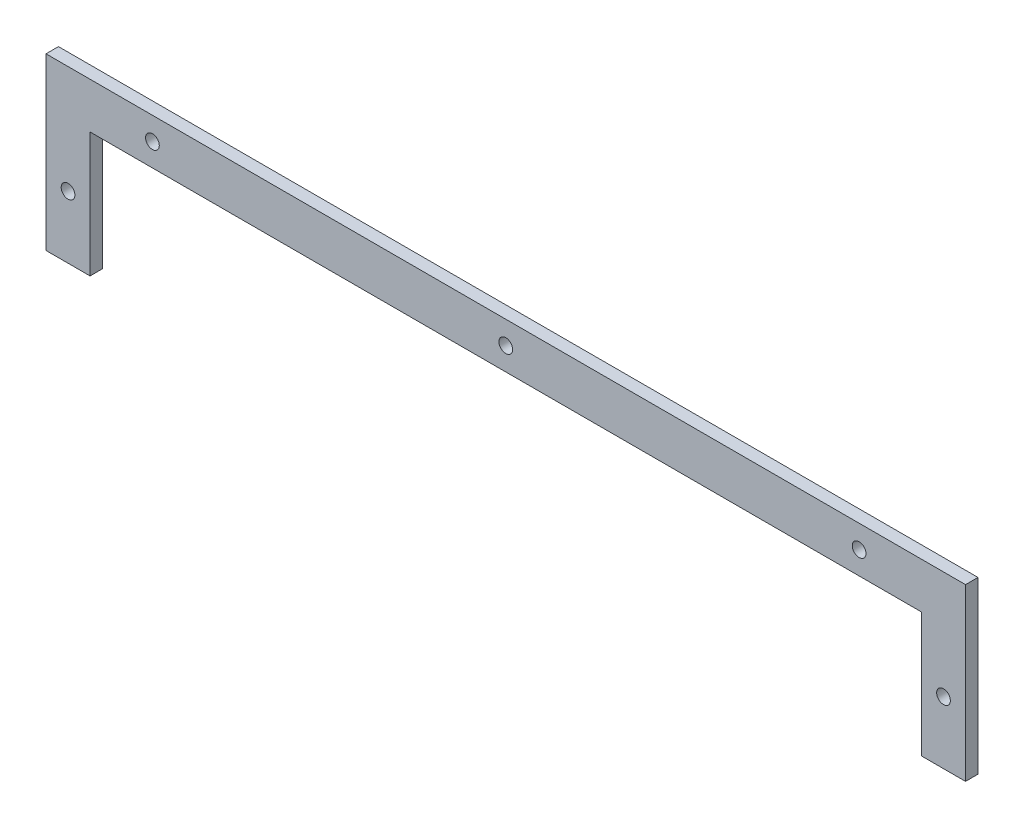
ISO-10303-21;
HEADER;
FILE_DESCRIPTION(('STEP AP214'),'2;1');
FILE_NAME('part.step','',(''),(''),'','','');
FILE_SCHEMA(('AUTOMOTIVE_DESIGN { 1 0 10303 214 1 1 1 1 }'));
ENDSEC;
DATA;
#1=APPLICATION_CONTEXT('core data for automotive mechanical design processes');
#2=APPLICATION_PROTOCOL_DEFINITION('international standard','automotive_design',2000,#1);
#3=PRODUCT_CONTEXT('',#1,'mechanical');
#4=PRODUCT('Part','Part','',(#3));
#5=PRODUCT_RELATED_PRODUCT_CATEGORY('part','',(#4));
#6=PRODUCT_DEFINITION_FORMATION('','',#4);
#7=PRODUCT_DEFINITION_CONTEXT('part definition',#1,'design');
#8=PRODUCT_DEFINITION('design','',#6,#7);
#9=PRODUCT_DEFINITION_SHAPE('','',#8);
#10=(LENGTH_UNIT() NAMED_UNIT(*) SI_UNIT(.MILLI.,.METRE.));
#11=(NAMED_UNIT(*) PLANE_ANGLE_UNIT() SI_UNIT($,.RADIAN.));
#12=(NAMED_UNIT(*) SI_UNIT($,.STERADIAN.) SOLID_ANGLE_UNIT());
#13=UNCERTAINTY_MEASURE_WITH_UNIT(LENGTH_MEASURE(1.E-05),#10,'distance_accuracy_value','');
#14=(GEOMETRIC_REPRESENTATION_CONTEXT(3) GLOBAL_UNCERTAINTY_ASSIGNED_CONTEXT((#13)) GLOBAL_UNIT_ASSIGNED_CONTEXT((#10,
#11,#12)) REPRESENTATION_CONTEXT('',''));
#15=CARTESIAN_POINT('',(0.,0.,0.));
#16=DIRECTION('',(0.,0.,1.));
#17=DIRECTION('',(1.,0.,0.));
#18=AXIS2_PLACEMENT_3D('',#15,#16,#17);
#19=CARTESIAN_POINT('',(0.,0.,3.));
#20=DIRECTION('',(0.,0.,-1.));
#21=DIRECTION('',(-1.,0.,0.));
#22=AXIS2_PLACEMENT_3D('',#19,#20,#21);
#23=PLANE('',#22);
#24=DIRECTION('',(0.,1.,0.));
#25=VECTOR('',#24,1.);
#26=CARTESIAN_POINT('',(76.1518031358719,236.850888729095,3.));
#27=LINE('',#26,#25);
#28=CARTESIAN_POINT('',(76.1518031358719,236.850888729095,3.));
#29=VERTEX_POINT('',#28);
#30=CARTESIAN_POINT('',(76.1518031358719,266.850888729095,3.));
#31=VERTEX_POINT('',#30);
#32=EDGE_CURVE('E151',#29,#31,#27,.T.);
#33=ORIENTED_EDGE('',*,*,#32,.T.);
#34=DIRECTION('',(1.,0.,0.));
#35=VECTOR('',#34,1.);
#36=CARTESIAN_POINT('',(76.1518031358719,266.850888729095,3.));
#37=LINE('',#36,#35);
#38=CARTESIAN_POINT('',(276.149988174438,266.850888729095,3.));
#39=VERTEX_POINT('',#38);
#40=EDGE_CURVE('E99',#31,#39,#37,.T.);
#41=ORIENTED_EDGE('',*,*,#40,.T.);
#42=DIRECTION('',(0.,-1.,0.));
#43=VECTOR('',#42,1.);
#44=CARTESIAN_POINT('',(276.149988174438,266.850888729095,3.));
#45=LINE('',#44,#43);
#46=CARTESIAN_POINT('',(276.149988174438,236.850888729095,3.));
#47=VERTEX_POINT('',#46);
#48=EDGE_CURVE('E166',#39,#47,#45,.T.);
#49=ORIENTED_EDGE('',*,*,#48,.T.);
#50=DIRECTION('',(1.,0.,0.));
#51=VECTOR('',#50,1.);
#52=CARTESIAN_POINT('',(276.149988174438,236.850888729095,3.));
#53=LINE('',#52,#51);
#54=CARTESIAN_POINT('',(286.750207375986,236.850888729095,3.));
#55=VERTEX_POINT('',#54);
#56=EDGE_CURVE('E179',#47,#55,#53,.T.);
#57=ORIENTED_EDGE('',*,*,#56,.T.);
#58=DIRECTION('',(-5.33201121228377E-06,0.999999999985785,0.));
#59=VECTOR('',#58,1.);
#60=CARTESIAN_POINT('',(286.750207375986,236.850888729095,3.));
#61=LINE('',#60,#59);
#62=CARTESIAN_POINT('',(286.749988794327,277.845112205294,3.));
#63=VERTEX_POINT('',#62);
#64=EDGE_CURVE('E118',#55,#63,#61,.T.);
#65=ORIENTED_EDGE('',*,*,#64,.T.);
#66=DIRECTION('',(-0.999999998598843,-5.29368899106635E-05,0.));
#67=VECTOR('',#66,1.);
#68=CARTESIAN_POINT('',(65.5498809996054,277.833402559523,3.));
#69=LINE('',#68,#67);
#70=CARTESIAN_POINT('',(65.5498809996054,277.833402559523,3.));
#71=VERTEX_POINT('',#70);
#72=EDGE_CURVE('E112',#63,#71,#69,.T.);
#73=ORIENTED_EDGE('',*,*,#72,.T.);
#74=DIRECTION('',(0.,-1.,0.));
#75=VECTOR('',#74,1.);
#76=CARTESIAN_POINT('',(65.5498809996054,277.833402559523,3.));
#77=LINE('',#76,#75);
#78=CARTESIAN_POINT('',(65.5498809996054,236.850888729095,3.));
#79=VERTEX_POINT('',#78);
#80=EDGE_CURVE('E116',#71,#79,#77,.T.);
#81=ORIENTED_EDGE('',*,*,#80,.T.);
#82=DIRECTION('',(1.,0.,0.));
#83=VECTOR('',#82,1.);
#84=CARTESIAN_POINT('',(76.1518031358719,236.850888729095,3.));
#85=LINE('',#84,#83);
#86=EDGE_CURVE('E56',#79,#29,#85,.T.);
#87=ORIENTED_EDGE('',*,*,#86,.T.);
#88=EDGE_LOOP('',(#33,#41,#49,#57,#65,#73,#81,#87));
#89=FACE_BOUND('',#88,.T.);
#90=CARTESIAN_POINT('',(70.8508420677386,251.850888729095,3.));
#91=DIRECTION('',(0.,0.,1.));
#92=DIRECTION('',(1.,0.,0.));
#93=AXIS2_PLACEMENT_3D('',#90,#91,#92);
#94=CIRCLE('',#93,1.65000000000003);
#95=CARTESIAN_POINT('',(72.5008420677387,251.850888729095,3.));
#96=VERTEX_POINT('',#95);
#97=EDGE_CURVE('E140',#96,#96,#94,.T.);
#98=ORIENTED_EDGE('',*,*,#97,.F.);
#99=EDGE_LOOP('',(#98));
#100=FACE_BOUND('',#99,.T.);
#101=CARTESIAN_POINT('',(91.1518031358719,272.342426260702,3.));
#102=DIRECTION('',(0.,0.,1.));
#103=DIRECTION('',(1.,0.,0.));
#104=AXIS2_PLACEMENT_3D('',#101,#102,#103);
#105=CIRCLE('',#104,1.65000000000003);
#106=CARTESIAN_POINT('',(92.8018031358719,272.342426260702,3.));
#107=VERTEX_POINT('',#106);
#108=EDGE_CURVE('E188',#107,#107,#105,.T.);
#109=ORIENTED_EDGE('',*,*,#108,.F.);
#110=EDGE_LOOP('',(#109));
#111=FACE_BOUND('',#110,.T.);
#112=CARTESIAN_POINT('',(176.149949567158,272.342426260702,3.));
#113=DIRECTION('',(0.,0.,1.));
#114=DIRECTION('',(1.,0.,0.));
#115=AXIS2_PLACEMENT_3D('',#112,#113,#114);
#116=CIRCLE('',#115,1.64999999999999);
#117=CARTESIAN_POINT('',(177.799949567158,272.342426260702,3.));
#118=VERTEX_POINT('',#117);
#119=EDGE_CURVE('E194',#118,#118,#116,.T.);
#120=ORIENTED_EDGE('',*,*,#119,.F.);
#121=EDGE_LOOP('',(#120));
#122=FACE_BOUND('',#121,.T.);
#123=CARTESIAN_POINT('',(261.148095998443,272.342426260702,3.));
#124=DIRECTION('',(0.,0.,1.));
#125=DIRECTION('',(1.,0.,0.));
#126=AXIS2_PLACEMENT_3D('',#123,#124,#125);
#127=CIRCLE('',#126,1.64999999999994);
#128=CARTESIAN_POINT('',(262.798095998443,272.342426260702,3.));
#129=VERTEX_POINT('',#128);
#130=EDGE_CURVE('E200',#129,#129,#127,.T.);
#131=ORIENTED_EDGE('',*,*,#130,.F.);
#132=EDGE_LOOP('',(#131));
#133=FACE_BOUND('',#132,.T.);
#134=CARTESIAN_POINT('',(281.449057066577,251.850888729095,3.));
#135=DIRECTION('',(0.,0.,1.));
#136=DIRECTION('',(1.,0.,0.));
#137=AXIS2_PLACEMENT_3D('',#134,#135,#136);
#138=CIRCLE('',#137,1.64999999999999);
#139=CARTESIAN_POINT('',(283.099057066577,251.850888729095,3.));
#140=VERTEX_POINT('',#139);
#141=EDGE_CURVE('E206',#140,#140,#138,.T.);
#142=ORIENTED_EDGE('',*,*,#141,.F.);
#143=EDGE_LOOP('',(#142));
#144=FACE_BOUND('',#143,.T.);
#145=ADVANCED_FACE('F39',(#89,#100,#111,#122,#133,#144),#23,.F.);
#146=CARTESIAN_POINT('',(0.,0.,0.));
#147=DIRECTION('',(0.,0.,-1.));
#148=DIRECTION('',(-1.,0.,0.));
#149=AXIS2_PLACEMENT_3D('',#146,#147,#148);
#150=PLANE('',#149);
#151=CARTESIAN_POINT('',(261.148095998443,272.342426260702,0.));
#152=DIRECTION('',(0.,0.,1.));
#153=DIRECTION('',(1.,0.,0.));
#154=AXIS2_PLACEMENT_3D('',#151,#152,#153);
#155=CIRCLE('',#154,1.64999999999994);
#156=CARTESIAN_POINT('',(262.798095998443,272.342426260702,0.));
#157=VERTEX_POINT('',#156);
#158=EDGE_CURVE('E203',#157,#157,#155,.T.);
#159=ORIENTED_EDGE('',*,*,#158,.T.);
#160=EDGE_LOOP('',(#159));
#161=FACE_BOUND('',#160,.T.);
#162=CARTESIAN_POINT('',(91.1518031358719,272.342426260702,0.));
#163=DIRECTION('',(0.,0.,1.));
#164=DIRECTION('',(1.,0.,0.));
#165=AXIS2_PLACEMENT_3D('',#162,#163,#164);
#166=CIRCLE('',#165,1.65000000000003);
#167=CARTESIAN_POINT('',(92.8018031358719,272.342426260702,0.));
#168=VERTEX_POINT('',#167);
#169=EDGE_CURVE('E191',#168,#168,#166,.T.);
#170=ORIENTED_EDGE('',*,*,#169,.T.);
#171=EDGE_LOOP('',(#170));
#172=FACE_BOUND('',#171,.T.);
#173=DIRECTION('',(0.,1.,0.));
#174=VECTOR('',#173,1.);
#175=CARTESIAN_POINT('',(76.1518031358719,236.850888729095,0.));
#176=LINE('',#175,#174);
#177=CARTESIAN_POINT('',(76.1518031358719,236.850888729095,0.));
#178=VERTEX_POINT('',#177);
#179=CARTESIAN_POINT('',(76.1518031358719,266.850888729095,0.));
#180=VERTEX_POINT('',#179);
#181=EDGE_CURVE('E136',#178,#180,#176,.T.);
#182=ORIENTED_EDGE('',*,*,#181,.F.);
#183=DIRECTION('',(1.,0.,0.));
#184=VECTOR('',#183,1.);
#185=CARTESIAN_POINT('',(76.1518031358719,236.850888729095,0.));
#186=LINE('',#185,#184);
#187=CARTESIAN_POINT('',(65.5498809996054,236.850888729095,0.));
#188=VERTEX_POINT('',#187);
#189=EDGE_CURVE('E91',#188,#178,#186,.T.);
#190=ORIENTED_EDGE('',*,*,#189,.F.);
#191=DIRECTION('',(0.,-1.,0.));
#192=VECTOR('',#191,1.);
#193=CARTESIAN_POINT('',(65.5498809996054,277.833402559523,0.));
#194=LINE('',#193,#192);
#195=CARTESIAN_POINT('',(65.5498809996054,277.833402559523,0.));
#196=VERTEX_POINT('',#195);
#197=EDGE_CURVE('E85',#196,#188,#194,.T.);
#198=ORIENTED_EDGE('',*,*,#197,.F.);
#199=DIRECTION('',(-0.999999998598843,-5.29368899106635E-05,0.));
#200=VECTOR('',#199,1.);
#201=CARTESIAN_POINT('',(65.5498809996054,277.833402559523,0.));
#202=LINE('',#201,#200);
#203=CARTESIAN_POINT('',(286.749988794327,277.845112205294,0.));
#204=VERTEX_POINT('',#203);
#205=EDGE_CURVE('E126',#204,#196,#202,.T.);
#206=ORIENTED_EDGE('',*,*,#205,.F.);
#207=DIRECTION('',(-5.33201121228377E-06,0.999999999985785,0.));
#208=VECTOR('',#207,1.);
#209=CARTESIAN_POINT('',(286.750207375986,236.850888729095,0.));
#210=LINE('',#209,#208);
#211=CARTESIAN_POINT('',(286.750207375986,236.850888729095,0.));
#212=VERTEX_POINT('',#211);
#213=EDGE_CURVE('E146',#212,#204,#210,.T.);
#214=ORIENTED_EDGE('',*,*,#213,.F.);
#215=DIRECTION('',(1.,0.,0.));
#216=VECTOR('',#215,1.);
#217=CARTESIAN_POINT('',(276.149988174438,236.850888729095,0.));
#218=LINE('',#217,#216);
#219=CARTESIAN_POINT('',(276.149988174438,236.850888729095,0.));
#220=VERTEX_POINT('',#219);
#221=EDGE_CURVE('E144',#220,#212,#218,.T.);
#222=ORIENTED_EDGE('',*,*,#221,.F.);
#223=DIRECTION('',(0.,-1.,0.));
#224=VECTOR('',#223,1.);
#225=CARTESIAN_POINT('',(276.149988174438,266.850888729095,0.));
#226=LINE('',#225,#224);
#227=CARTESIAN_POINT('',(276.149988174438,266.850888729095,0.));
#228=VERTEX_POINT('',#227);
#229=EDGE_CURVE('E142',#228,#220,#226,.T.);
#230=ORIENTED_EDGE('',*,*,#229,.F.);
#231=DIRECTION('',(1.,0.,0.));
#232=VECTOR('',#231,1.);
#233=CARTESIAN_POINT('',(76.1518031358719,266.850888729095,0.));
#234=LINE('',#233,#232);
#235=EDGE_CURVE('E139',#180,#228,#234,.T.);
#236=ORIENTED_EDGE('',*,*,#235,.F.);
#237=EDGE_LOOP('',(#182,#190,#198,#206,#214,#222,#230,#236));
#238=FACE_BOUND('',#237,.T.);
#239=CARTESIAN_POINT('',(70.8508420677386,251.850888729095,0.));
#240=DIRECTION('',(0.,0.,1.));
#241=DIRECTION('',(1.,0.,0.));
#242=AXIS2_PLACEMENT_3D('',#239,#240,#241);
#243=CIRCLE('',#242,1.65000000000003);
#244=CARTESIAN_POINT('',(72.5008420677387,251.850888729095,0.));
#245=VERTEX_POINT('',#244);
#246=EDGE_CURVE('E185',#245,#245,#243,.T.);
#247=ORIENTED_EDGE('',*,*,#246,.T.);
#248=EDGE_LOOP('',(#247));
#249=FACE_BOUND('',#248,.T.);
#250=CARTESIAN_POINT('',(176.149949567158,272.342426260702,0.));
#251=DIRECTION('',(0.,0.,1.));
#252=DIRECTION('',(1.,0.,0.));
#253=AXIS2_PLACEMENT_3D('',#250,#251,#252);
#254=CIRCLE('',#253,1.64999999999999);
#255=CARTESIAN_POINT('',(177.799949567158,272.342426260702,0.));
#256=VERTEX_POINT('',#255);
#257=EDGE_CURVE('E197',#256,#256,#254,.T.);
#258=ORIENTED_EDGE('',*,*,#257,.T.);
#259=EDGE_LOOP('',(#258));
#260=FACE_BOUND('',#259,.T.);
#261=CARTESIAN_POINT('',(281.449057066577,251.850888729095,0.));
#262=DIRECTION('',(0.,0.,1.));
#263=DIRECTION('',(1.,0.,0.));
#264=AXIS2_PLACEMENT_3D('',#261,#262,#263);
#265=CIRCLE('',#264,1.64999999999999);
#266=CARTESIAN_POINT('',(283.099057066577,251.850888729095,0.));
#267=VERTEX_POINT('',#266);
#268=EDGE_CURVE('E209',#267,#267,#265,.T.);
#269=ORIENTED_EDGE('',*,*,#268,.T.);
#270=EDGE_LOOP('',(#269));
#271=FACE_BOUND('',#270,.T.);
#272=ADVANCED_FACE('F170',(#161,#172,#238,#249,#260,#271),#150,.T.);
#273=CARTESIAN_POINT('',(76.1518031358719,236.850888729095,3.));
#274=DIRECTION('',(-1.,0.,0.));
#275=DIRECTION('',(0.,0.,1.));
#276=AXIS2_PLACEMENT_3D('',#273,#274,#275);
#277=PLANE('',#276);
#278=ORIENTED_EDGE('',*,*,#181,.T.);
#279=DIRECTION('',(0.,0.,-1.));
#280=VECTOR('',#279,1.);
#281=CARTESIAN_POINT('',(76.1518031358719,266.850888729095,3.));
#282=LINE('',#281,#280);
#283=EDGE_CURVE('E11',#31,#180,#282,.T.);
#284=ORIENTED_EDGE('',*,*,#283,.F.);
#285=ORIENTED_EDGE('',*,*,#32,.F.);
#286=DIRECTION('',(0.,0.,-1.));
#287=VECTOR('',#286,1.);
#288=CARTESIAN_POINT('',(76.1518031358719,236.850888729095,3.));
#289=LINE('',#288,#287);
#290=EDGE_CURVE('E132',#29,#178,#289,.T.);
#291=ORIENTED_EDGE('',*,*,#290,.T.);
#292=EDGE_LOOP('',(#278,#284,#285,#291));
#293=FACE_BOUND('',#292,.T.);
#294=ADVANCED_FACE('F41',(#293),#277,.F.);
#295=CARTESIAN_POINT('',(76.1518031358719,266.850888729095,3.));
#296=DIRECTION('',(0.,1.,0.));
#297=DIRECTION('',(0.,0.,1.));
#298=AXIS2_PLACEMENT_3D('',#295,#296,#297);
#299=PLANE('',#298);
#300=ORIENTED_EDGE('',*,*,#235,.T.);
#301=DIRECTION('',(0.,0.,-1.));
#302=VECTOR('',#301,1.);
#303=CARTESIAN_POINT('',(276.149988174438,266.850888729095,3.));
#304=LINE('',#303,#302);
#305=EDGE_CURVE('E48',#39,#228,#304,.T.);
#306=ORIENTED_EDGE('',*,*,#305,.F.);
#307=ORIENTED_EDGE('',*,*,#40,.F.);
#308=ORIENTED_EDGE('',*,*,#283,.T.);
#309=EDGE_LOOP('',(#300,#306,#307,#308));
#310=FACE_BOUND('',#309,.T.);
#311=ADVANCED_FACE('F241',(#310),#299,.F.);
#312=CARTESIAN_POINT('',(276.149988174438,266.850888729095,3.));
#313=DIRECTION('',(1.,0.,0.));
#314=DIRECTION('',(0.,0.,-1.));
#315=AXIS2_PLACEMENT_3D('',#312,#313,#314);
#316=PLANE('',#315);
#317=ORIENTED_EDGE('',*,*,#229,.T.);
#318=DIRECTION('',(0.,0.,-1.));
#319=VECTOR('',#318,1.);
#320=CARTESIAN_POINT('',(276.149988174438,236.850888729095,3.));
#321=LINE('',#320,#319);
#322=EDGE_CURVE('E158',#47,#220,#321,.T.);
#323=ORIENTED_EDGE('',*,*,#322,.F.);
#324=ORIENTED_EDGE('',*,*,#48,.F.);
#325=ORIENTED_EDGE('',*,*,#305,.T.);
#326=EDGE_LOOP('',(#317,#323,#324,#325));
#327=FACE_BOUND('',#326,.T.);
#328=ADVANCED_FACE('F164',(#327),#316,.F.);
#329=CARTESIAN_POINT('',(276.149988174438,236.850888729095,3.));
#330=DIRECTION('',(0.,1.,0.));
#331=DIRECTION('',(0.,0.,1.));
#332=AXIS2_PLACEMENT_3D('',#329,#330,#331);
#333=PLANE('',#332);
#334=ORIENTED_EDGE('',*,*,#221,.T.);
#335=DIRECTION('',(0.,0.,-1.));
#336=VECTOR('',#335,1.);
#337=CARTESIAN_POINT('',(286.750207375986,236.850888729095,3.));
#338=LINE('',#337,#336);
#339=EDGE_CURVE('E155',#55,#212,#338,.T.);
#340=ORIENTED_EDGE('',*,*,#339,.F.);
#341=ORIENTED_EDGE('',*,*,#56,.F.);
#342=ORIENTED_EDGE('',*,*,#322,.T.);
#343=EDGE_LOOP('',(#334,#340,#341,#342));
#344=FACE_BOUND('',#343,.T.);
#345=ADVANCED_FACE('F175',(#344),#333,.F.);
#346=CARTESIAN_POINT('',(286.750207375986,236.850888729095,3.));
#347=DIRECTION('',(-0.999999999985785,-5.33201121228377E-06,0.));
#348=DIRECTION('',(5.33201121228377E-06,-0.999999999985785,0.));
#349=AXIS2_PLACEMENT_3D('',#346,#347,#348);
#350=PLANE('',#349);
#351=ORIENTED_EDGE('',*,*,#213,.T.);
#352=DIRECTION('',(0.,0.,-1.));
#353=VECTOR('',#352,1.);
#354=CARTESIAN_POINT('',(286.749988794327,277.845112205294,3.));
#355=LINE('',#354,#353);
#356=EDGE_CURVE('E127',#63,#204,#355,.T.);
#357=ORIENTED_EDGE('',*,*,#356,.F.);
#358=ORIENTED_EDGE('',*,*,#64,.F.);
#359=ORIENTED_EDGE('',*,*,#339,.T.);
#360=EDGE_LOOP('',(#351,#357,#358,#359));
#361=FACE_BOUND('',#360,.T.);
#362=ADVANCED_FACE('F178',(#361),#350,.F.);
#363=CARTESIAN_POINT('',(65.5498809996054,277.833402559523,3.));
#364=DIRECTION('',(5.29368899106635E-05,-0.999999998598843,0.));
#365=DIRECTION('',(0.999999998598843,5.29368899106635E-05,0.));
#366=AXIS2_PLACEMENT_3D('',#363,#364,#365);
#367=PLANE('',#366);
#368=ORIENTED_EDGE('',*,*,#205,.T.);
#369=DIRECTION('',(0.,0.,-1.));
#370=VECTOR('',#369,1.);
#371=CARTESIAN_POINT('',(65.5498809996054,277.833402559523,3.));
#372=LINE('',#371,#370);
#373=EDGE_CURVE('E123',#71,#196,#372,.T.);
#374=ORIENTED_EDGE('',*,*,#373,.F.);
#375=ORIENTED_EDGE('',*,*,#72,.F.);
#376=ORIENTED_EDGE('',*,*,#356,.T.);
#377=EDGE_LOOP('',(#368,#374,#375,#376));
#378=FACE_BOUND('',#377,.T.);
#379=ADVANCED_FACE('F124',(#378),#367,.F.);
#380=CARTESIAN_POINT('',(65.5498809996054,277.833402559523,3.));
#381=DIRECTION('',(1.,0.,0.));
#382=DIRECTION('',(0.,1.,0.));
#383=AXIS2_PLACEMENT_3D('',#380,#381,#382);
#384=PLANE('',#383);
#385=ORIENTED_EDGE('',*,*,#197,.T.);
#386=DIRECTION('',(0.,0.,-1.));
#387=VECTOR('',#386,1.);
#388=CARTESIAN_POINT('',(65.5498809996054,236.850888729095,3.));
#389=LINE('',#388,#387);
#390=EDGE_CURVE('E128',#79,#188,#389,.T.);
#391=ORIENTED_EDGE('',*,*,#390,.F.);
#392=ORIENTED_EDGE('',*,*,#80,.F.);
#393=ORIENTED_EDGE('',*,*,#373,.T.);
#394=EDGE_LOOP('',(#385,#391,#392,#393));
#395=FACE_BOUND('',#394,.T.);
#396=ADVANCED_FACE('F130',(#395),#384,.F.);
#397=CARTESIAN_POINT('',(76.1518031358719,236.850888729095,3.));
#398=DIRECTION('',(0.,1.,0.));
#399=DIRECTION('',(0.,0.,1.));
#400=AXIS2_PLACEMENT_3D('',#397,#398,#399);
#401=PLANE('',#400);
#402=ORIENTED_EDGE('',*,*,#189,.T.);
#403=ORIENTED_EDGE('',*,*,#290,.F.);
#404=ORIENTED_EDGE('',*,*,#86,.F.);
#405=ORIENTED_EDGE('',*,*,#390,.T.);
#406=EDGE_LOOP('',(#402,#403,#404,#405));
#407=FACE_BOUND('',#406,.T.);
#408=ADVANCED_FACE('F229',(#407),#401,.F.);
#409=CARTESIAN_POINT('',(70.8508420677386,251.850888729095,3.));
#410=DIRECTION('',(0.,0.,-1.));
#411=DIRECTION('',(-1.,0.,0.));
#412=AXIS2_PLACEMENT_3D('',#409,#410,#411);
#413=CYLINDRICAL_SURFACE('',#412,1.65000000000003);
#414=ORIENTED_EDGE('',*,*,#97,.T.);
#415=EDGE_LOOP('',(#414));
#416=FACE_BOUND('',#415,.T.);
#417=ORIENTED_EDGE('',*,*,#246,.F.);
#418=EDGE_LOOP('',(#417));
#419=FACE_BOUND('',#418,.T.);
#420=ADVANCED_FACE('F226',(#416,#419),#413,.F.);
#421=CARTESIAN_POINT('',(91.1518031358719,272.342426260702,3.));
#422=DIRECTION('',(0.,0.,-1.));
#423=DIRECTION('',(-1.,0.,0.));
#424=AXIS2_PLACEMENT_3D('',#421,#422,#423);
#425=CYLINDRICAL_SURFACE('',#424,1.65000000000003);
#426=ORIENTED_EDGE('',*,*,#108,.T.);
#427=EDGE_LOOP('',(#426));
#428=FACE_BOUND('',#427,.T.);
#429=ORIENTED_EDGE('',*,*,#169,.F.);
#430=EDGE_LOOP('',(#429));
#431=FACE_BOUND('',#430,.T.);
#432=ADVANCED_FACE('F304',(#428,#431),#425,.F.);
#433=CARTESIAN_POINT('',(176.149949567158,272.342426260702,3.));
#434=DIRECTION('',(0.,0.,-1.));
#435=DIRECTION('',(-1.,0.,0.));
#436=AXIS2_PLACEMENT_3D('',#433,#434,#435);
#437=CYLINDRICAL_SURFACE('',#436,1.64999999999999);
#438=ORIENTED_EDGE('',*,*,#119,.T.);
#439=EDGE_LOOP('',(#438));
#440=FACE_BOUND('',#439,.T.);
#441=ORIENTED_EDGE('',*,*,#257,.F.);
#442=EDGE_LOOP('',(#441));
#443=FACE_BOUND('',#442,.T.);
#444=ADVANCED_FACE('F312',(#440,#443),#437,.F.);
#445=CARTESIAN_POINT('',(261.148095998443,272.342426260702,3.));
#446=DIRECTION('',(0.,0.,-1.));
#447=DIRECTION('',(-1.,0.,0.));
#448=AXIS2_PLACEMENT_3D('',#445,#446,#447);
#449=CYLINDRICAL_SURFACE('',#448,1.64999999999994);
#450=ORIENTED_EDGE('',*,*,#130,.T.);
#451=EDGE_LOOP('',(#450));
#452=FACE_BOUND('',#451,.T.);
#453=ORIENTED_EDGE('',*,*,#158,.F.);
#454=EDGE_LOOP('',(#453));
#455=FACE_BOUND('',#454,.T.);
#456=ADVANCED_FACE('F320',(#452,#455),#449,.F.);
#457=CARTESIAN_POINT('',(281.449057066577,251.850888729095,3.));
#458=DIRECTION('',(0.,0.,-1.));
#459=DIRECTION('',(-1.,0.,0.));
#460=AXIS2_PLACEMENT_3D('',#457,#458,#459);
#461=CYLINDRICAL_SURFACE('',#460,1.64999999999999);
#462=ORIENTED_EDGE('',*,*,#141,.T.);
#463=EDGE_LOOP('',(#462));
#464=FACE_BOUND('',#463,.T.);
#465=ORIENTED_EDGE('',*,*,#268,.F.);
#466=EDGE_LOOP('',(#465));
#467=FACE_BOUND('',#466,.T.);
#468=ADVANCED_FACE('F215',(#464,#467),#461,.F.);
#469=CLOSED_SHELL('',(#145,#272,#294,#311,#328,#345,#362,#379,#396,#408,#420,#432,#444,#456,#468));
#470=MANIFOLD_SOLID_BREP('B2',#469);
#471=ADVANCED_BREP_SHAPE_REPRESENTATION('',(#18,#470),#14);
#472=SHAPE_DEFINITION_REPRESENTATION(#9,#471);
ENDSEC;
END-ISO-10303-21;
